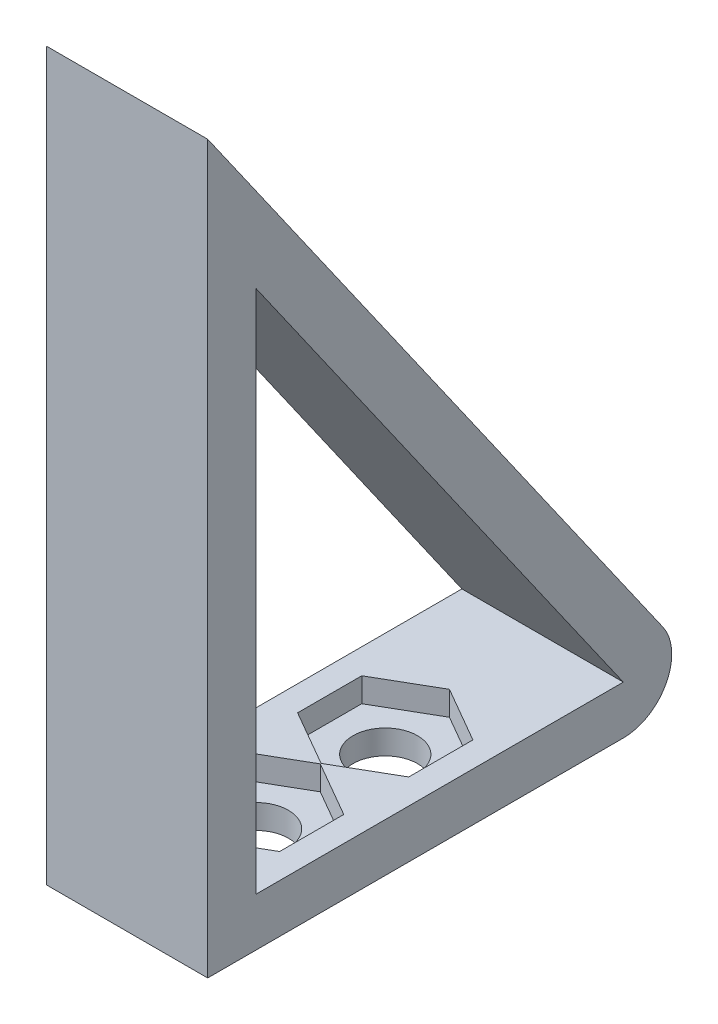
ISO-10303-21;
HEADER;
FILE_DESCRIPTION(('STEP AP214'),'2;1');
FILE_NAME('part.step','',(''),(''),'','','');
FILE_SCHEMA(('AUTOMOTIVE_DESIGN { 1 0 10303 214 1 1 1 1 }'));
ENDSEC;
DATA;
#1=APPLICATION_CONTEXT('core data for automotive mechanical design processes');
#2=APPLICATION_PROTOCOL_DEFINITION('international standard','automotive_design',2000,#1);
#3=PRODUCT_CONTEXT('',#1,'mechanical');
#4=PRODUCT('Part','Part','',(#3));
#5=PRODUCT_RELATED_PRODUCT_CATEGORY('part','',(#4));
#6=PRODUCT_DEFINITION_FORMATION('','',#4);
#7=PRODUCT_DEFINITION_CONTEXT('part definition',#1,'design');
#8=PRODUCT_DEFINITION('design','',#6,#7);
#9=PRODUCT_DEFINITION_SHAPE('','',#8);
#10=(LENGTH_UNIT() NAMED_UNIT(*) SI_UNIT(.MILLI.,.METRE.));
#11=(NAMED_UNIT(*) PLANE_ANGLE_UNIT() SI_UNIT($,.RADIAN.));
#12=(NAMED_UNIT(*) SI_UNIT($,.STERADIAN.) SOLID_ANGLE_UNIT());
#13=UNCERTAINTY_MEASURE_WITH_UNIT(LENGTH_MEASURE(1.E-05),#10,'distance_accuracy_value','');
#14=(GEOMETRIC_REPRESENTATION_CONTEXT(3) GLOBAL_UNCERTAINTY_ASSIGNED_CONTEXT((#13)) GLOBAL_UNIT_ASSIGNED_CONTEXT((#10,
#11,#12)) REPRESENTATION_CONTEXT('',''));
#15=CARTESIAN_POINT('',(0.,0.,0.));
#16=DIRECTION('',(0.,0.,1.));
#17=DIRECTION('',(1.,0.,0.));
#18=AXIS2_PLACEMENT_3D('',#15,#16,#17);
#19=CARTESIAN_POINT('',(-5.,3.,-16.));
#20=DIRECTION('',(0.,-1.,0.));
#21=DIRECTION('',(0.,0.,-1.));
#22=AXIS2_PLACEMENT_3D('',#19,#20,#21);
#23=CYLINDRICAL_SURFACE('',#22,2.00000000000001);
#24=CARTESIAN_POINT('',(-5.,0.,-16.));
#25=DIRECTION('',(0.,-1.,0.));
#26=DIRECTION('',(0.,0.,-1.));
#27=AXIS2_PLACEMENT_3D('',#24,#25,#26);
#28=CIRCLE('',#27,2.00000000000001);
#29=CARTESIAN_POINT('',(-5.,0.,-18.));
#30=VERTEX_POINT('',#29);
#31=EDGE_CURVE('E318',#30,#30,#28,.T.);
#32=ORIENTED_EDGE('',*,*,#31,.T.);
#33=EDGE_LOOP('',(#32));
#34=FACE_BOUND('',#33,.T.);
#35=CARTESIAN_POINT('',(-5.,1.5,-16.));
#36=DIRECTION('',(0.,1.,0.));
#37=DIRECTION('',(0.,0.,1.));
#38=AXIS2_PLACEMENT_3D('',#35,#36,#37);
#39=CIRCLE('',#38,2.00000000000001);
#40=CARTESIAN_POINT('',(-5.,1.5,-14.));
#41=VERTEX_POINT('',#40);
#42=EDGE_CURVE('E322',#41,#41,#39,.F.);
#43=ORIENTED_EDGE('',*,*,#42,.F.);
#44=EDGE_LOOP('',(#43));
#45=FACE_BOUND('',#44,.T.);
#46=ADVANCED_FACE('F39',(#34,#45),#23,.F.);
#47=CARTESIAN_POINT('',(-5.,3.,-8.));
#48=DIRECTION('',(0.,-1.,0.));
#49=DIRECTION('',(0.,0.,-1.));
#50=AXIS2_PLACEMENT_3D('',#47,#48,#49);
#51=CYLINDRICAL_SURFACE('',#50,2.);
#52=CARTESIAN_POINT('',(-5.,0.,-8.));
#53=DIRECTION('',(0.,-1.,0.));
#54=DIRECTION('',(0.,0.,-1.));
#55=AXIS2_PLACEMENT_3D('',#52,#53,#54);
#56=CIRCLE('',#55,2.);
#57=CARTESIAN_POINT('',(-5.,0.,-10.));
#58=VERTEX_POINT('',#57);
#59=EDGE_CURVE('E313',#58,#58,#56,.T.);
#60=ORIENTED_EDGE('',*,*,#59,.T.);
#61=EDGE_LOOP('',(#60));
#62=FACE_BOUND('',#61,.T.);
#63=CARTESIAN_POINT('',(-5.,1.5,-8.));
#64=DIRECTION('',(0.,1.,0.));
#65=DIRECTION('',(0.,0.,1.));
#66=AXIS2_PLACEMENT_3D('',#63,#64,#65);
#67=CIRCLE('',#66,2.);
#68=CARTESIAN_POINT('',(-5.,1.5,-6.));
#69=VERTEX_POINT('',#68);
#70=EDGE_CURVE('E236',#69,#69,#67,.F.);
#71=ORIENTED_EDGE('',*,*,#70,.F.);
#72=EDGE_LOOP('',(#71));
#73=FACE_BOUND('',#72,.T.);
#74=ADVANCED_FACE('F417',(#62,#73),#51,.F.);
#75=CARTESIAN_POINT('',(-10.,0.,-31.5093392194366));
#76=DIRECTION('',(0.,-1.,0.));
#77=DIRECTION('',(0.,0.,-1.));
#78=AXIS2_PLACEMENT_3D('',#75,#76,#77);
#79=PLANE('',#78);
#80=ORIENTED_EDGE('',*,*,#59,.F.);
#81=EDGE_LOOP('',(#80));
#82=FACE_BOUND('',#81,.T.);
#83=ORIENTED_EDGE('',*,*,#31,.F.);
#84=EDGE_LOOP('',(#83));
#85=FACE_BOUND('',#84,.T.);
#86=DIRECTION('',(0.,0.,-1.));
#87=VECTOR('',#86,1.);
#88=CARTESIAN_POINT('',(-10.,0.,-31.5093392194366));
#89=LINE('',#88,#87);
#90=CARTESIAN_POINT('',(-10.,0.,0.));
#91=VERTEX_POINT('',#90);
#92=CARTESIAN_POINT('',(-10.,0.,-25.7463928385231));
#93=VERTEX_POINT('',#92);
#94=EDGE_CURVE('E356',#91,#93,#89,.T.);
#95=ORIENTED_EDGE('',*,*,#94,.T.);
#96=DIRECTION('',(1.,0.,0.));
#97=VECTOR('',#96,1.);
#98=CARTESIAN_POINT('',(-10.,0.,-25.7463928385231));
#99=LINE('',#98,#97);
#100=CARTESIAN_POINT('',(0.,0.,-25.7463928385231));
#101=VERTEX_POINT('',#100);
#102=EDGE_CURVE('E380',#93,#101,#99,.T.);
#103=ORIENTED_EDGE('',*,*,#102,.T.);
#104=DIRECTION('',(0.,0.,-1.));
#105=VECTOR('',#104,1.);
#106=CARTESIAN_POINT('',(0.,0.,-31.5093392194366));
#107=LINE('',#106,#105);
#108=CARTESIAN_POINT('',(0.,0.,0.));
#109=VERTEX_POINT('',#108);
#110=EDGE_CURVE('E349',#109,#101,#107,.T.);
#111=ORIENTED_EDGE('',*,*,#110,.F.);
#112=DIRECTION('',(1.,0.,0.));
#113=VECTOR('',#112,1.);
#114=CARTESIAN_POINT('',(-10.,0.,0.));
#115=LINE('',#114,#113);
#116=EDGE_CURVE('E377',#91,#109,#115,.T.);
#117=ORIENTED_EDGE('',*,*,#116,.F.);
#118=EDGE_LOOP('',(#95,#103,#111,#117));
#119=FACE_BOUND('',#118,.T.);
#120=ADVANCED_FACE('F398',(#82,#85,#119),#79,.T.);
#121=CARTESIAN_POINT('',(-10.,0.,0.));
#122=DIRECTION('',(0.,0.,1.));
#123=DIRECTION('',(1.,0.,0.));
#124=AXIS2_PLACEMENT_3D('',#121,#122,#123);
#125=PLANE('',#124);
#126=DIRECTION('',(0.,-1.,0.));
#127=VECTOR('',#126,1.);
#128=CARTESIAN_POINT('',(0.,0.,0.));
#129=LINE('',#128,#127);
#130=CARTESIAN_POINT('',(0.,45.,0.));
#131=VERTEX_POINT('',#130);
#132=EDGE_CURVE('E361',#131,#109,#129,.T.);
#133=ORIENTED_EDGE('',*,*,#132,.F.);
#134=DIRECTION('',(1.,0.,0.));
#135=VECTOR('',#134,1.);
#136=CARTESIAN_POINT('',(-10.,45.,0.));
#137=LINE('',#136,#135);
#138=CARTESIAN_POINT('',(-10.,45.,0.));
#139=VERTEX_POINT('',#138);
#140=EDGE_CURVE('E368',#139,#131,#137,.T.);
#141=ORIENTED_EDGE('',*,*,#140,.F.);
#142=DIRECTION('',(0.,-1.,0.));
#143=VECTOR('',#142,1.);
#144=CARTESIAN_POINT('',(-10.,0.,0.));
#145=LINE('',#144,#143);
#146=EDGE_CURVE('E364',#139,#91,#145,.T.);
#147=ORIENTED_EDGE('',*,*,#146,.T.);
#148=ORIENTED_EDGE('',*,*,#116,.T.);
#149=EDGE_LOOP('',(#133,#141,#147,#148));
#150=FACE_BOUND('',#149,.T.);
#151=ADVANCED_FACE('F406',(#150),#125,.T.);
#152=CARTESIAN_POINT('',(-10.,45.,0.));
#153=DIRECTION('',(0.,0.573576436351042,-0.819152044288995));
#154=DIRECTION('',(0.,0.819152044288995,0.573576436351042));
#155=AXIS2_PLACEMENT_3D('',#152,#153,#154);
#156=PLANE('',#155);
#157=DIRECTION('',(0.,0.819152044288995,0.573576436351041));
#158=VECTOR('',#157,1.);
#159=CARTESIAN_POINT('',(0.,45.,0.));
#160=LINE('',#159,#158);
#161=CARTESIAN_POINT('',(0.,4.72072930905314,-28.2038489713901));
#162=VERTEX_POINT('',#161);
#163=EDGE_CURVE('E371',#162,#131,#160,.T.);
#164=ORIENTED_EDGE('',*,*,#163,.F.);
#165=DIRECTION('',(1.,0.,0.));
#166=VECTOR('',#165,1.);
#167=CARTESIAN_POINT('',(-10.,4.72072930905312,-28.2038489713901));
#168=LINE('',#167,#166);
#169=CARTESIAN_POINT('',(-10.,4.72072930905314,-28.2038489713901));
#170=VERTEX_POINT('',#169);
#171=EDGE_CURVE('E48',#162,#170,#168,.F.);
#172=ORIENTED_EDGE('',*,*,#171,.T.);
#173=DIRECTION('',(0.,0.819152044288995,0.573576436351041));
#174=VECTOR('',#173,1.);
#175=CARTESIAN_POINT('',(-10.,45.,0.));
#176=LINE('',#175,#174);
#177=EDGE_CURVE('E360',#170,#139,#176,.T.);
#178=ORIENTED_EDGE('',*,*,#177,.T.);
#179=ORIENTED_EDGE('',*,*,#140,.T.);
#180=EDGE_LOOP('',(#164,#172,#178,#179));
#181=FACE_BOUND('',#180,.T.);
#182=ADVANCED_FACE('F443',(#181),#156,.T.);
#183=CARTESIAN_POINT('',(-10.,0.,0.));
#184=DIRECTION('',(-1.,0.,0.));
#185=DIRECTION('',(0.,0.,1.));
#186=AXIS2_PLACEMENT_3D('',#183,#184,#185);
#187=PLANE('',#186);
#188=DIRECTION('',(0.,0.,-1.));
#189=VECTOR('',#188,1.);
#190=CARTESIAN_POINT('',(-10.,3.,-3.));
#191=LINE('',#190,#189);
#192=CARTESIAN_POINT('',(-10.,3.,-3.));
#193=VERTEX_POINT('',#192);
#194=CARTESIAN_POINT('',(-10.,3.,-25.7463928385231));
#195=VERTEX_POINT('',#194);
#196=EDGE_CURVE('E323',#193,#195,#191,.T.);
#197=ORIENTED_EDGE('',*,*,#196,.T.);
#198=DIRECTION('',(0.,0.819152044288995,0.573576436351041));
#199=VECTOR('',#198,1.);
#200=CARTESIAN_POINT('',(-10.,3.,-25.7463928385231));
#201=LINE('',#200,#199);
#202=CARTESIAN_POINT('',(-10.,35.4852155929103,-3.00000000000001));
#203=VERTEX_POINT('',#202);
#204=EDGE_CURVE('E327',#195,#203,#201,.T.);
#205=ORIENTED_EDGE('',*,*,#204,.T.);
#206=DIRECTION('',(0.,-1.,0.));
#207=VECTOR('',#206,1.);
#208=CARTESIAN_POINT('',(-10.,35.4852155929103,-3.));
#209=LINE('',#208,#207);
#210=EDGE_CURVE('E332',#203,#193,#209,.T.);
#211=ORIENTED_EDGE('',*,*,#210,.T.);
#212=EDGE_LOOP('',(#197,#205,#211));
#213=FACE_BOUND('',#212,.T.);
#214=ORIENTED_EDGE('',*,*,#177,.F.);
#215=CARTESIAN_POINT('',(-10.,3.,-25.7463928385231));
#216=DIRECTION('',(-1.,0.,0.));
#217=DIRECTION('',(0.,0.,1.));
#218=AXIS2_PLACEMENT_3D('',#215,#216,#217);
#219=CIRCLE('',#218,3.);
#220=EDGE_CURVE('E11',#170,#93,#219,.T.);
#221=ORIENTED_EDGE('',*,*,#220,.T.);
#222=ORIENTED_EDGE('',*,*,#94,.F.);
#223=ORIENTED_EDGE('',*,*,#146,.F.);
#224=EDGE_LOOP('',(#214,#221,#222,#223));
#225=FACE_BOUND('',#224,.T.);
#226=ADVANCED_FACE('F409',(#213,#225),#187,.T.);
#227=CARTESIAN_POINT('',(0.,0.,0.));
#228=DIRECTION('',(-1.,0.,0.));
#229=DIRECTION('',(0.,0.,1.));
#230=AXIS2_PLACEMENT_3D('',#227,#228,#229);
#231=PLANE('',#230);
#232=DIRECTION('',(0.,0.819152044288995,0.573576436351041));
#233=VECTOR('',#232,1.);
#234=CARTESIAN_POINT('',(0.,3.,-25.7463928385231));
#235=LINE('',#234,#233);
#236=CARTESIAN_POINT('',(0.,3.,-25.7463928385231));
#237=VERTEX_POINT('',#236);
#238=CARTESIAN_POINT('',(0.,35.4852155929103,-3.));
#239=VERTEX_POINT('',#238);
#240=EDGE_CURVE('E339',#237,#239,#235,.T.);
#241=ORIENTED_EDGE('',*,*,#240,.F.);
#242=DIRECTION('',(0.,0.,-1.));
#243=VECTOR('',#242,1.);
#244=CARTESIAN_POINT('',(0.,3.,-3.));
#245=LINE('',#244,#243);
#246=CARTESIAN_POINT('',(0.,3.,-3.));
#247=VERTEX_POINT('',#246);
#248=EDGE_CURVE('E317',#247,#237,#245,.T.);
#249=ORIENTED_EDGE('',*,*,#248,.F.);
#250=DIRECTION('',(0.,-1.,0.));
#251=VECTOR('',#250,1.);
#252=CARTESIAN_POINT('',(0.,35.4852155929103,-3.));
#253=LINE('',#252,#251);
#254=EDGE_CURVE('E328',#239,#247,#253,.T.);
#255=ORIENTED_EDGE('',*,*,#254,.F.);
#256=EDGE_LOOP('',(#241,#249,#255));
#257=FACE_BOUND('',#256,.T.);
#258=ORIENTED_EDGE('',*,*,#110,.T.);
#259=CARTESIAN_POINT('',(0.,3.,-25.7463928385231));
#260=DIRECTION('',(-1.,0.,0.));
#261=DIRECTION('',(0.,0.,1.));
#262=AXIS2_PLACEMENT_3D('',#259,#260,#261);
#263=CIRCLE('',#262,3.);
#264=EDGE_CURVE('E62',#101,#162,#263,.F.);
#265=ORIENTED_EDGE('',*,*,#264,.T.);
#266=ORIENTED_EDGE('',*,*,#163,.T.);
#267=ORIENTED_EDGE('',*,*,#132,.T.);
#268=EDGE_LOOP('',(#258,#265,#266,#267));
#269=FACE_BOUND('',#268,.T.);
#270=ADVANCED_FACE('F402',(#257,#269),#231,.F.);
#271=CARTESIAN_POINT('',(-10.,3.,-3.));
#272=DIRECTION('',(0.,-1.,0.));
#273=DIRECTION('',(0.,0.,-1.));
#274=AXIS2_PLACEMENT_3D('',#271,#272,#273);
#275=PLANE('',#274);
#276=DIRECTION('',(0.866025403784439,0.,-0.5));
#277=VECTOR('',#276,1.);
#278=CARTESIAN_POINT('',(-5.,3.,-12.025));
#279=LINE('',#278,#277);
#280=CARTESIAN_POINT('',(-5.,3.,-12.025));
#281=VERTEX_POINT('',#280);
#282=CARTESIAN_POINT('',(-1.55754901995686,3.,-14.0125));
#283=VERTEX_POINT('',#282);
#284=EDGE_CURVE('E218',#281,#283,#279,.T.);
#285=ORIENTED_EDGE('',*,*,#284,.F.);
#286=DIRECTION('',(0.866025403784438,0.,0.5));
#287=VECTOR('',#286,1.);
#288=CARTESIAN_POINT('',(-8.44245098004314,3.,-14.0125));
#289=LINE('',#288,#287);
#290=CARTESIAN_POINT('',(-8.44245098004314,3.,-14.0125));
#291=VERTEX_POINT('',#290);
#292=EDGE_CURVE('E176',#291,#281,#289,.T.);
#293=ORIENTED_EDGE('',*,*,#292,.F.);
#294=DIRECTION('',(0.,0.,1.));
#295=VECTOR('',#294,1.);
#296=CARTESIAN_POINT('',(-8.44245098004314,3.,-17.9875));
#297=LINE('',#296,#295);
#298=CARTESIAN_POINT('',(-8.44245098004314,3.,-17.9875));
#299=VERTEX_POINT('',#298);
#300=EDGE_CURVE('E198',#299,#291,#297,.T.);
#301=ORIENTED_EDGE('',*,*,#300,.F.);
#302=DIRECTION('',(-0.866025403784439,0.,0.5));
#303=VECTOR('',#302,1.);
#304=CARTESIAN_POINT('',(-5.,3.,-19.975));
#305=LINE('',#304,#303);
#306=CARTESIAN_POINT('',(-5.,3.,-19.975));
#307=VERTEX_POINT('',#306);
#308=EDGE_CURVE('E202',#307,#299,#305,.T.);
#309=ORIENTED_EDGE('',*,*,#308,.F.);
#310=DIRECTION('',(-0.866025403784438,0.,-0.5));
#311=VECTOR('',#310,1.);
#312=CARTESIAN_POINT('',(-1.55754901995686,3.,-17.9875));
#313=LINE('',#312,#311);
#314=CARTESIAN_POINT('',(-1.55754901995686,3.,-17.9875));
#315=VERTEX_POINT('',#314);
#316=EDGE_CURVE('E226',#315,#307,#313,.T.);
#317=ORIENTED_EDGE('',*,*,#316,.F.);
#318=DIRECTION('',(0.,0.,-1.));
#319=VECTOR('',#318,1.);
#320=CARTESIAN_POINT('',(-1.55754901995686,3.,-14.0125));
#321=LINE('',#320,#319);
#322=EDGE_CURVE('E222',#283,#315,#321,.T.);
#323=ORIENTED_EDGE('',*,*,#322,.F.);
#324=EDGE_LOOP('',(#285,#293,#301,#309,#317,#323));
#325=FACE_BOUND('',#324,.T.);
#326=DIRECTION('',(-0.866025403784439,0.,0.5));
#327=VECTOR('',#326,1.);
#328=CARTESIAN_POINT('',(-5.,3.,-11.975));
#329=LINE('',#328,#327);
#330=CARTESIAN_POINT('',(-5.,3.,-11.975));
#331=VERTEX_POINT('',#330);
#332=CARTESIAN_POINT('',(-8.44245098004314,3.,-9.9875));
#333=VERTEX_POINT('',#332);
#334=EDGE_CURVE('E277',#331,#333,#329,.T.);
#335=ORIENTED_EDGE('',*,*,#334,.F.);
#336=DIRECTION('',(-0.866025403784439,0.,-0.5));
#337=VECTOR('',#336,1.);
#338=CARTESIAN_POINT('',(-1.55754901995686,3.,-9.9875));
#339=LINE('',#338,#337);
#340=CARTESIAN_POINT('',(-1.55754901995686,3.,-9.9875));
#341=VERTEX_POINT('',#340);
#342=EDGE_CURVE('E274',#341,#331,#339,.T.);
#343=ORIENTED_EDGE('',*,*,#342,.F.);
#344=DIRECTION('',(0.,0.,-1.));
#345=VECTOR('',#344,1.);
#346=CARTESIAN_POINT('',(-1.55754901995686,3.,-6.0125));
#347=LINE('',#346,#345);
#348=CARTESIAN_POINT('',(-1.55754901995686,3.,-6.0125));
#349=VERTEX_POINT('',#348);
#350=EDGE_CURVE('E253',#349,#341,#347,.T.);
#351=ORIENTED_EDGE('',*,*,#350,.F.);
#352=DIRECTION('',(0.866025403784438,0.,-0.5));
#353=VECTOR('',#352,1.);
#354=CARTESIAN_POINT('',(-5.,3.,-4.025));
#355=LINE('',#354,#353);
#356=CARTESIAN_POINT('',(-5.,3.,-4.025));
#357=VERTEX_POINT('',#356);
#358=EDGE_CURVE('E289',#357,#349,#355,.T.);
#359=ORIENTED_EDGE('',*,*,#358,.F.);
#360=DIRECTION('',(0.866025403784439,0.,0.5));
#361=VECTOR('',#360,1.);
#362=CARTESIAN_POINT('',(-8.44245098004314,3.,-6.0125));
#363=LINE('',#362,#361);
#364=CARTESIAN_POINT('',(-8.44245098004314,3.,-6.0125));
#365=VERTEX_POINT('',#364);
#366=EDGE_CURVE('E285',#365,#357,#363,.T.);
#367=ORIENTED_EDGE('',*,*,#366,.F.);
#368=DIRECTION('',(0.,0.,1.));
#369=VECTOR('',#368,1.);
#370=CARTESIAN_POINT('',(-8.44245098004314,3.,-9.9875));
#371=LINE('',#370,#369);
#372=EDGE_CURVE('E281',#333,#365,#371,.T.);
#373=ORIENTED_EDGE('',*,*,#372,.F.);
#374=EDGE_LOOP('',(#335,#343,#351,#359,#367,#373));
#375=FACE_BOUND('',#374,.T.);
#376=ORIENTED_EDGE('',*,*,#248,.T.);
#377=DIRECTION('',(1.,0.,0.));
#378=VECTOR('',#377,1.);
#379=CARTESIAN_POINT('',(-10.,3.,-25.7463928385231));
#380=LINE('',#379,#378);
#381=EDGE_CURVE('E336',#195,#237,#380,.T.);
#382=ORIENTED_EDGE('',*,*,#381,.F.);
#383=ORIENTED_EDGE('',*,*,#196,.F.);
#384=DIRECTION('',(1.,0.,0.));
#385=VECTOR('',#384,1.);
#386=CARTESIAN_POINT('',(-10.,3.,-3.));
#387=LINE('',#386,#385);
#388=EDGE_CURVE('E346',#193,#247,#387,.T.);
#389=ORIENTED_EDGE('',*,*,#388,.T.);
#390=EDGE_LOOP('',(#376,#382,#383,#389));
#391=FACE_BOUND('',#390,.T.);
#392=ADVANCED_FACE('F432',(#325,#375,#391),#275,.F.);
#393=CARTESIAN_POINT('',(-10.,35.4852155929103,-3.));
#394=DIRECTION('',(0.,0.,1.));
#395=DIRECTION('',(0.,-1.,0.));
#396=AXIS2_PLACEMENT_3D('',#393,#394,#395);
#397=PLANE('',#396);
#398=ORIENTED_EDGE('',*,*,#254,.T.);
#399=ORIENTED_EDGE('',*,*,#388,.F.);
#400=ORIENTED_EDGE('',*,*,#210,.F.);
#401=DIRECTION('',(1.,0.,0.));
#402=VECTOR('',#401,1.);
#403=CARTESIAN_POINT('',(-10.,35.4852155929103,-3.));
#404=LINE('',#403,#402);
#405=EDGE_CURVE('E350',#203,#239,#404,.T.);
#406=ORIENTED_EDGE('',*,*,#405,.T.);
#407=EDGE_LOOP('',(#398,#399,#400,#406));
#408=FACE_BOUND('',#407,.T.);
#409=ADVANCED_FACE('F428',(#408),#397,.F.);
#410=CARTESIAN_POINT('',(-10.,3.,-25.7463928385231));
#411=DIRECTION('',(0.,0.573576436351041,-0.819152044288995));
#412=DIRECTION('',(0.,0.819152044288995,0.573576436351042));
#413=AXIS2_PLACEMENT_3D('',#410,#411,#412);
#414=PLANE('',#413);
#415=ORIENTED_EDGE('',*,*,#240,.T.);
#416=ORIENTED_EDGE('',*,*,#405,.F.);
#417=ORIENTED_EDGE('',*,*,#204,.F.);
#418=ORIENTED_EDGE('',*,*,#381,.T.);
#419=EDGE_LOOP('',(#415,#416,#417,#418));
#420=FACE_BOUND('',#419,.T.);
#421=ADVANCED_FACE('F431',(#420),#414,.F.);
#422=CARTESIAN_POINT('',(0.,1.5,0.));
#423=DIRECTION('',(0.,1.,0.));
#424=DIRECTION('',(0.,0.,1.));
#425=AXIS2_PLACEMENT_3D('',#422,#423,#424);
#426=PLANE('',#425);
#427=DIRECTION('',(-0.866025403784439,0.,-0.5));
#428=VECTOR('',#427,1.);
#429=CARTESIAN_POINT('',(-1.55754901995686,1.5,-9.9875));
#430=LINE('',#429,#428);
#431=CARTESIAN_POINT('',(-1.55754901995686,1.5,-9.9875));
#432=VERTEX_POINT('',#431);
#433=CARTESIAN_POINT('',(-5.,1.5,-11.975));
#434=VERTEX_POINT('',#433);
#435=EDGE_CURVE('E248',#432,#434,#430,.T.);
#436=ORIENTED_EDGE('',*,*,#435,.T.);
#437=DIRECTION('',(-0.866025403784439,0.,0.5));
#438=VECTOR('',#437,1.);
#439=CARTESIAN_POINT('',(-5.,1.5,-11.975));
#440=LINE('',#439,#438);
#441=CARTESIAN_POINT('',(-8.44245098004314,1.5,-9.9875));
#442=VERTEX_POINT('',#441);
#443=EDGE_CURVE('E252',#434,#442,#440,.T.);
#444=ORIENTED_EDGE('',*,*,#443,.T.);
#445=DIRECTION('',(0.,0.,1.));
#446=VECTOR('',#445,1.);
#447=CARTESIAN_POINT('',(-8.44245098004314,1.5,-9.9875));
#448=LINE('',#447,#446);
#449=CARTESIAN_POINT('',(-8.44245098004314,1.5,-6.0125));
#450=VERTEX_POINT('',#449);
#451=EDGE_CURVE('E257',#442,#450,#448,.T.);
#452=ORIENTED_EDGE('',*,*,#451,.T.);
#453=DIRECTION('',(0.866025403784439,0.,0.5));
#454=VECTOR('',#453,1.);
#455=CARTESIAN_POINT('',(-8.44245098004314,1.5,-6.0125));
#456=LINE('',#455,#454);
#457=CARTESIAN_POINT('',(-5.,1.5,-4.025));
#458=VERTEX_POINT('',#457);
#459=EDGE_CURVE('E261',#450,#458,#456,.T.);
#460=ORIENTED_EDGE('',*,*,#459,.T.);
#461=DIRECTION('',(0.866025403784438,0.,-0.5));
#462=VECTOR('',#461,1.);
#463=CARTESIAN_POINT('',(-5.,1.5,-4.025));
#464=LINE('',#463,#462);
#465=CARTESIAN_POINT('',(-1.55754901995686,1.5,-6.0125));
#466=VERTEX_POINT('',#465);
#467=EDGE_CURVE('E265',#458,#466,#464,.T.);
#468=ORIENTED_EDGE('',*,*,#467,.T.);
#469=DIRECTION('',(0.,0.,-1.));
#470=VECTOR('',#469,1.);
#471=CARTESIAN_POINT('',(-1.55754901995686,1.5,-6.0125));
#472=LINE('',#471,#470);
#473=EDGE_CURVE('E269',#466,#432,#472,.T.);
#474=ORIENTED_EDGE('',*,*,#473,.T.);
#475=EDGE_LOOP('',(#436,#444,#452,#460,#468,#474));
#476=FACE_BOUND('',#475,.T.);
#477=ORIENTED_EDGE('',*,*,#70,.T.);
#478=EDGE_LOOP('',(#477));
#479=FACE_BOUND('',#478,.T.);
#480=ADVANCED_FACE('F436',(#476,#479),#426,.T.);
#481=CARTESIAN_POINT('',(-1.55754901995686,1.5,-9.9875));
#482=DIRECTION('',(0.5,0.,-0.866025403784439));
#483=DIRECTION('',(-0.866025403784439,0.,-0.5));
#484=AXIS2_PLACEMENT_3D('',#481,#482,#483);
#485=PLANE('',#484);
#486=ORIENTED_EDGE('',*,*,#342,.T.);
#487=DIRECTION('',(0.,1.,0.));
#488=VECTOR('',#487,1.);
#489=CARTESIAN_POINT('',(-5.,1.5,-11.975));
#490=LINE('',#489,#488);
#491=EDGE_CURVE('E273',#434,#331,#490,.T.);
#492=ORIENTED_EDGE('',*,*,#491,.F.);
#493=ORIENTED_EDGE('',*,*,#435,.F.);
#494=DIRECTION('',(0.,1.,0.));
#495=VECTOR('',#494,1.);
#496=CARTESIAN_POINT('',(-1.55754901995686,1.5,-9.9875));
#497=LINE('',#496,#495);
#498=EDGE_CURVE('E219',#432,#341,#497,.T.);
#499=ORIENTED_EDGE('',*,*,#498,.T.);
#500=EDGE_LOOP('',(#486,#492,#493,#499));
#501=FACE_BOUND('',#500,.T.);
#502=ADVANCED_FACE('F462',(#501),#485,.F.);
#503=CARTESIAN_POINT('',(-1.55754901995686,1.5,-6.0125));
#504=DIRECTION('',(1.,0.,0.));
#505=DIRECTION('',(0.,0.,-1.));
#506=AXIS2_PLACEMENT_3D('',#503,#504,#505);
#507=PLANE('',#506);
#508=ORIENTED_EDGE('',*,*,#350,.T.);
#509=ORIENTED_EDGE('',*,*,#498,.F.);
#510=ORIENTED_EDGE('',*,*,#473,.F.);
#511=DIRECTION('',(0.,1.,0.));
#512=VECTOR('',#511,1.);
#513=CARTESIAN_POINT('',(-1.55754901995686,1.5,-6.0125));
#514=LINE('',#513,#512);
#515=EDGE_CURVE('E298',#466,#349,#514,.T.);
#516=ORIENTED_EDGE('',*,*,#515,.T.);
#517=EDGE_LOOP('',(#508,#509,#510,#516));
#518=FACE_BOUND('',#517,.T.);
#519=ADVANCED_FACE('F468',(#518),#507,.F.);
#520=CARTESIAN_POINT('',(-5.,1.5,-4.025));
#521=DIRECTION('',(0.5,0.,0.866025403784439));
#522=DIRECTION('',(0.866025403784439,0.,-0.5));
#523=AXIS2_PLACEMENT_3D('',#520,#521,#522);
#524=PLANE('',#523);
#525=ORIENTED_EDGE('',*,*,#358,.T.);
#526=ORIENTED_EDGE('',*,*,#515,.F.);
#527=ORIENTED_EDGE('',*,*,#467,.F.);
#528=DIRECTION('',(0.,1.,0.));
#529=VECTOR('',#528,1.);
#530=CARTESIAN_POINT('',(-5.,1.5,-4.025));
#531=LINE('',#530,#529);
#532=EDGE_CURVE('E301',#458,#357,#531,.T.);
#533=ORIENTED_EDGE('',*,*,#532,.T.);
#534=EDGE_LOOP('',(#525,#526,#527,#533));
#535=FACE_BOUND('',#534,.T.);
#536=ADVANCED_FACE('F474',(#535),#524,.F.);
#537=CARTESIAN_POINT('',(-8.44245098004314,1.5,-6.0125));
#538=DIRECTION('',(-0.5,0.,0.866025403784439));
#539=DIRECTION('',(0.866025403784439,0.,0.5));
#540=AXIS2_PLACEMENT_3D('',#537,#538,#539);
#541=PLANE('',#540);
#542=ORIENTED_EDGE('',*,*,#366,.T.);
#543=ORIENTED_EDGE('',*,*,#532,.F.);
#544=ORIENTED_EDGE('',*,*,#459,.F.);
#545=DIRECTION('',(0.,1.,0.));
#546=VECTOR('',#545,1.);
#547=CARTESIAN_POINT('',(-8.44245098004314,1.5,-6.0125));
#548=LINE('',#547,#546);
#549=EDGE_CURVE('E304',#450,#365,#548,.T.);
#550=ORIENTED_EDGE('',*,*,#549,.T.);
#551=EDGE_LOOP('',(#542,#543,#544,#550));
#552=FACE_BOUND('',#551,.T.);
#553=ADVANCED_FACE('F478',(#552),#541,.F.);
#554=CARTESIAN_POINT('',(-8.44245098004314,1.5,-9.9875));
#555=DIRECTION('',(-1.,0.,0.));
#556=DIRECTION('',(0.,0.,1.));
#557=AXIS2_PLACEMENT_3D('',#554,#555,#556);
#558=PLANE('',#557);
#559=ORIENTED_EDGE('',*,*,#372,.T.);
#560=ORIENTED_EDGE('',*,*,#549,.F.);
#561=ORIENTED_EDGE('',*,*,#451,.F.);
#562=DIRECTION('',(0.,1.,0.));
#563=VECTOR('',#562,1.);
#564=CARTESIAN_POINT('',(-8.44245098004314,1.5,-9.9875));
#565=LINE('',#564,#563);
#566=EDGE_CURVE('E307',#442,#333,#565,.T.);
#567=ORIENTED_EDGE('',*,*,#566,.T.);
#568=EDGE_LOOP('',(#559,#560,#561,#567));
#569=FACE_BOUND('',#568,.T.);
#570=ADVANCED_FACE('F482',(#569),#558,.F.);
#571=CARTESIAN_POINT('',(-5.,1.5,-11.975));
#572=DIRECTION('',(-0.5,0.,-0.866025403784438));
#573=DIRECTION('',(-0.866025403784439,0.,0.5));
#574=AXIS2_PLACEMENT_3D('',#571,#572,#573);
#575=PLANE('',#574);
#576=ORIENTED_EDGE('',*,*,#334,.T.);
#577=ORIENTED_EDGE('',*,*,#566,.F.);
#578=ORIENTED_EDGE('',*,*,#443,.F.);
#579=ORIENTED_EDGE('',*,*,#491,.T.);
#580=EDGE_LOOP('',(#576,#577,#578,#579));
#581=FACE_BOUND('',#580,.T.);
#582=ADVANCED_FACE('F486',(#581),#575,.F.);
#583=CARTESIAN_POINT('',(0.,1.5,0.));
#584=DIRECTION('',(0.,1.,0.));
#585=DIRECTION('',(0.,0.,1.));
#586=AXIS2_PLACEMENT_3D('',#583,#584,#585);
#587=PLANE('',#586);
#588=DIRECTION('',(0.866025403784438,0.,0.5));
#589=VECTOR('',#588,1.);
#590=CARTESIAN_POINT('',(-8.44245098004314,1.5,-14.0125));
#591=LINE('',#590,#589);
#592=CARTESIAN_POINT('',(-8.44245098004314,1.5,-14.0125));
#593=VERTEX_POINT('',#592);
#594=CARTESIAN_POINT('',(-5.,1.5,-12.025));
#595=VERTEX_POINT('',#594);
#596=EDGE_CURVE('E173',#593,#595,#591,.T.);
#597=ORIENTED_EDGE('',*,*,#596,.T.);
#598=DIRECTION('',(0.866025403784439,0.,-0.5));
#599=VECTOR('',#598,1.);
#600=CARTESIAN_POINT('',(-5.,1.5,-12.025));
#601=LINE('',#600,#599);
#602=CARTESIAN_POINT('',(-1.55754901995686,1.5,-14.0125));
#603=VERTEX_POINT('',#602);
#604=EDGE_CURVE('E185',#595,#603,#601,.T.);
#605=ORIENTED_EDGE('',*,*,#604,.T.);
#606=DIRECTION('',(0.,0.,-1.));
#607=VECTOR('',#606,1.);
#608=CARTESIAN_POINT('',(-1.55754901995686,1.5,-14.0125));
#609=LINE('',#608,#607);
#610=CARTESIAN_POINT('',(-1.55754901995686,1.5,-17.9875));
#611=VERTEX_POINT('',#610);
#612=EDGE_CURVE('E191',#603,#611,#609,.T.);
#613=ORIENTED_EDGE('',*,*,#612,.T.);
#614=DIRECTION('',(-0.866025403784438,0.,-0.5));
#615=VECTOR('',#614,1.);
#616=CARTESIAN_POINT('',(-1.55754901995686,1.5,-17.9875));
#617=LINE('',#616,#615);
#618=CARTESIAN_POINT('',(-5.,1.5,-19.975));
#619=VERTEX_POINT('',#618);
#620=EDGE_CURVE('E207',#611,#619,#617,.T.);
#621=ORIENTED_EDGE('',*,*,#620,.T.);
#622=DIRECTION('',(-0.866025403784439,0.,0.5));
#623=VECTOR('',#622,1.);
#624=CARTESIAN_POINT('',(-5.,1.5,-19.975));
#625=LINE('',#624,#623);
#626=CARTESIAN_POINT('',(-8.44245098004314,1.5,-17.9875));
#627=VERTEX_POINT('',#626);
#628=EDGE_CURVE('E211',#619,#627,#625,.T.);
#629=ORIENTED_EDGE('',*,*,#628,.T.);
#630=DIRECTION('',(0.,0.,1.));
#631=VECTOR('',#630,1.);
#632=CARTESIAN_POINT('',(-8.44245098004314,1.5,-17.9875));
#633=LINE('',#632,#631);
#634=EDGE_CURVE('E182',#627,#593,#633,.T.);
#635=ORIENTED_EDGE('',*,*,#634,.T.);
#636=EDGE_LOOP('',(#597,#605,#613,#621,#629,#635));
#637=FACE_BOUND('',#636,.T.);
#638=ORIENTED_EDGE('',*,*,#42,.T.);
#639=EDGE_LOOP('',(#638));
#640=FACE_BOUND('',#639,.T.);
#641=ADVANCED_FACE('F193',(#637,#640),#587,.T.);
#642=CARTESIAN_POINT('',(-8.44245098004314,1.5,-14.0125));
#643=DIRECTION('',(-0.500000000000001,0.,0.866025403784438));
#644=DIRECTION('',(0.866025403784438,0.,0.500000000000001));
#645=AXIS2_PLACEMENT_3D('',#642,#643,#644);
#646=PLANE('',#645);
#647=ORIENTED_EDGE('',*,*,#292,.T.);
#648=DIRECTION('',(0.,1.,0.));
#649=VECTOR('',#648,1.);
#650=CARTESIAN_POINT('',(-5.,1.5,-12.025));
#651=LINE('',#650,#649);
#652=EDGE_CURVE('E169',#595,#281,#651,.T.);
#653=ORIENTED_EDGE('',*,*,#652,.F.);
#654=ORIENTED_EDGE('',*,*,#596,.F.);
#655=DIRECTION('',(0.,1.,0.));
#656=VECTOR('',#655,1.);
#657=CARTESIAN_POINT('',(-8.44245098004314,1.5,-14.0125));
#658=LINE('',#657,#656);
#659=EDGE_CURVE('E233',#593,#291,#658,.T.);
#660=ORIENTED_EDGE('',*,*,#659,.T.);
#661=EDGE_LOOP('',(#647,#653,#654,#660));
#662=FACE_BOUND('',#661,.T.);
#663=ADVANCED_FACE('F171',(#662),#646,.F.);
#664=CARTESIAN_POINT('',(-8.44245098004314,1.5,-17.9875));
#665=DIRECTION('',(-1.,0.,0.));
#666=DIRECTION('',(0.,0.,1.));
#667=AXIS2_PLACEMENT_3D('',#664,#665,#666);
#668=PLANE('',#667);
#669=ORIENTED_EDGE('',*,*,#300,.T.);
#670=ORIENTED_EDGE('',*,*,#659,.F.);
#671=ORIENTED_EDGE('',*,*,#634,.F.);
#672=DIRECTION('',(0.,1.,0.));
#673=VECTOR('',#672,1.);
#674=CARTESIAN_POINT('',(-8.44245098004314,1.5,-17.9875));
#675=LINE('',#674,#673);
#676=EDGE_CURVE('E237',#627,#299,#675,.T.);
#677=ORIENTED_EDGE('',*,*,#676,.T.);
#678=EDGE_LOOP('',(#669,#670,#671,#677));
#679=FACE_BOUND('',#678,.T.);
#680=ADVANCED_FACE('F517',(#679),#668,.F.);
#681=CARTESIAN_POINT('',(-5.,1.5,-19.975));
#682=DIRECTION('',(-0.5,0.,-0.866025403784439));
#683=DIRECTION('',(-0.866025403784439,0.,0.5));
#684=AXIS2_PLACEMENT_3D('',#681,#682,#683);
#685=PLANE('',#684);
#686=ORIENTED_EDGE('',*,*,#308,.T.);
#687=ORIENTED_EDGE('',*,*,#676,.F.);
#688=ORIENTED_EDGE('',*,*,#628,.F.);
#689=DIRECTION('',(0.,1.,0.));
#690=VECTOR('',#689,1.);
#691=CARTESIAN_POINT('',(-5.,1.5,-19.975));
#692=LINE('',#691,#690);
#693=EDGE_CURVE('E240',#619,#307,#692,.T.);
#694=ORIENTED_EDGE('',*,*,#693,.T.);
#695=EDGE_LOOP('',(#686,#687,#688,#694));
#696=FACE_BOUND('',#695,.T.);
#697=ADVANCED_FACE('F521',(#696),#685,.F.);
#698=CARTESIAN_POINT('',(-1.55754901995686,1.5,-17.9875));
#699=DIRECTION('',(0.5,0.,-0.866025403784439));
#700=DIRECTION('',(-0.866025403784439,0.,-0.5));
#701=AXIS2_PLACEMENT_3D('',#698,#699,#700);
#702=PLANE('',#701);
#703=ORIENTED_EDGE('',*,*,#316,.T.);
#704=ORIENTED_EDGE('',*,*,#693,.F.);
#705=ORIENTED_EDGE('',*,*,#620,.F.);
#706=DIRECTION('',(0.,1.,0.));
#707=VECTOR('',#706,1.);
#708=CARTESIAN_POINT('',(-1.55754901995686,1.5,-17.9875));
#709=LINE('',#708,#707);
#710=EDGE_CURVE('E243',#611,#315,#709,.T.);
#711=ORIENTED_EDGE('',*,*,#710,.T.);
#712=EDGE_LOOP('',(#703,#704,#705,#711));
#713=FACE_BOUND('',#712,.T.);
#714=ADVANCED_FACE('F525',(#713),#702,.F.);
#715=CARTESIAN_POINT('',(-1.55754901995686,1.5,-14.0125));
#716=DIRECTION('',(1.,0.,0.));
#717=DIRECTION('',(0.,0.,-1.));
#718=AXIS2_PLACEMENT_3D('',#715,#716,#717);
#719=PLANE('',#718);
#720=ORIENTED_EDGE('',*,*,#322,.T.);
#721=ORIENTED_EDGE('',*,*,#710,.F.);
#722=ORIENTED_EDGE('',*,*,#612,.F.);
#723=DIRECTION('',(0.,1.,0.));
#724=VECTOR('',#723,1.);
#725=CARTESIAN_POINT('',(-1.55754901995686,1.5,-14.0125));
#726=LINE('',#725,#724);
#727=EDGE_CURVE('E181',#603,#283,#726,.T.);
#728=ORIENTED_EDGE('',*,*,#727,.T.);
#729=EDGE_LOOP('',(#720,#721,#722,#728));
#730=FACE_BOUND('',#729,.T.);
#731=ADVANCED_FACE('F414',(#730),#719,.F.);
#732=CARTESIAN_POINT('',(-5.,1.5,-12.025));
#733=DIRECTION('',(0.5,0.,0.866025403784439));
#734=DIRECTION('',(0.866025403784439,0.,-0.5));
#735=AXIS2_PLACEMENT_3D('',#732,#733,#734);
#736=PLANE('',#735);
#737=ORIENTED_EDGE('',*,*,#284,.T.);
#738=ORIENTED_EDGE('',*,*,#727,.F.);
#739=ORIENTED_EDGE('',*,*,#604,.F.);
#740=ORIENTED_EDGE('',*,*,#652,.T.);
#741=EDGE_LOOP('',(#737,#738,#739,#740));
#742=FACE_BOUND('',#741,.T.);
#743=ADVANCED_FACE('F186',(#742),#736,.F.);
#744=CARTESIAN_POINT('',(-10.,3.,-25.7463928385231));
#745=DIRECTION('',(1.,0.,0.));
#746=DIRECTION('',(0.,0.,-1.));
#747=AXIS2_PLACEMENT_3D('',#744,#745,#746);
#748=CYLINDRICAL_SURFACE('',#747,3.);
#749=ORIENTED_EDGE('',*,*,#220,.F.);
#750=ORIENTED_EDGE('',*,*,#171,.F.);
#751=ORIENTED_EDGE('',*,*,#264,.F.);
#752=ORIENTED_EDGE('',*,*,#102,.F.);
#753=EDGE_LOOP('',(#749,#750,#751,#752));
#754=FACE_BOUND('',#753,.T.);
#755=ADVANCED_FACE('F41',(#754),#748,.T.);
#756=CLOSED_SHELL('',(#46,#74,#120,#151,#182,#226,#270,#392,#409,#421,#480,#502,#519,#536,#553,
#570,#582,#641,#663,#680,#697,#714,#731,#743,#755));
#757=MANIFOLD_SOLID_BREP('B2',#756);
#758=ADVANCED_BREP_SHAPE_REPRESENTATION('',(#18,#757),#14);
#759=SHAPE_DEFINITION_REPRESENTATION(#9,#758);
ENDSEC;
END-ISO-10303-21;
